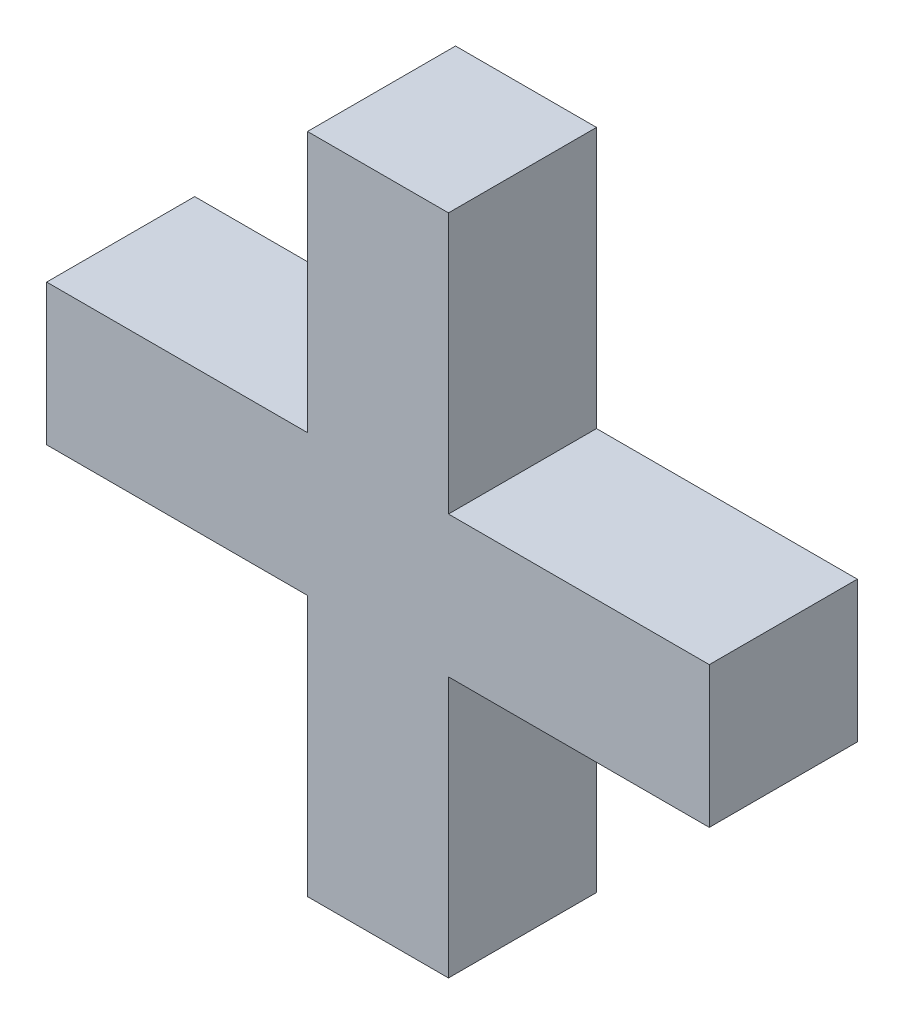
ISO-10303-21;
HEADER;
FILE_DESCRIPTION(('STEP AP214'),'2;1');
FILE_NAME('part.step','',(''),(''),'','','');
FILE_SCHEMA(('AUTOMOTIVE_DESIGN { 1 0 10303 214 1 1 1 1 }'));
ENDSEC;
DATA;
#1=APPLICATION_CONTEXT('core data for automotive mechanical design processes');
#2=APPLICATION_PROTOCOL_DEFINITION('international standard','automotive_design',2000,#1);
#3=PRODUCT_CONTEXT('',#1,'mechanical');
#4=PRODUCT('Part','Part','',(#3));
#5=PRODUCT_RELATED_PRODUCT_CATEGORY('part','',(#4));
#6=PRODUCT_DEFINITION_FORMATION('','',#4);
#7=PRODUCT_DEFINITION_CONTEXT('part definition',#1,'design');
#8=PRODUCT_DEFINITION('design','',#6,#7);
#9=PRODUCT_DEFINITION_SHAPE('','',#8);
#10=(LENGTH_UNIT() NAMED_UNIT(*) SI_UNIT(.MILLI.,.METRE.));
#11=(NAMED_UNIT(*) PLANE_ANGLE_UNIT() SI_UNIT($,.RADIAN.));
#12=(NAMED_UNIT(*) SI_UNIT($,.STERADIAN.) SOLID_ANGLE_UNIT());
#13=UNCERTAINTY_MEASURE_WITH_UNIT(LENGTH_MEASURE(1.E-05),#10,'distance_accuracy_value','');
#14=(GEOMETRIC_REPRESENTATION_CONTEXT(3) GLOBAL_UNCERTAINTY_ASSIGNED_CONTEXT((#13)) GLOBAL_UNIT_ASSIGNED_CONTEXT((#10,
#11,#12)) REPRESENTATION_CONTEXT('',''));
#15=CARTESIAN_POINT('',(0.,0.,0.));
#16=DIRECTION('',(0.,0.,1.));
#17=DIRECTION('',(1.,0.,0.));
#18=AXIS2_PLACEMENT_3D('',#15,#16,#17);
#19=CARTESIAN_POINT('',(0.,0.,10.5));
#20=DIRECTION('',(1.,0.,0.));
#21=DIRECTION('',(0.,0.,-1.));
#22=AXIS2_PLACEMENT_3D('',#19,#20,#21);
#23=PLANE('',#22);
#24=DIRECTION('',(0.,-1.,0.));
#25=VECTOR('',#24,1.);
#26=CARTESIAN_POINT('',(0.,0.,0.));
#27=LINE('',#26,#25);
#28=CARTESIAN_POINT('',(0.,18.5,0.));
#29=VERTEX_POINT('',#28);
#30=CARTESIAN_POINT('',(0.,0.,0.));
#31=VERTEX_POINT('',#30);
#32=EDGE_CURVE('E153',#29,#31,#27,.T.);
#33=ORIENTED_EDGE('',*,*,#32,.T.);
#34=DIRECTION('',(0.,0.,-1.));
#35=VECTOR('',#34,1.);
#36=CARTESIAN_POINT('',(0.,0.,10.5));
#37=LINE('',#36,#35);
#38=CARTESIAN_POINT('',(0.,0.,10.5));
#39=VERTEX_POINT('',#38);
#40=EDGE_CURVE('E11',#39,#31,#37,.T.);
#41=ORIENTED_EDGE('',*,*,#40,.F.);
#42=DIRECTION('',(0.,-1.,0.));
#43=VECTOR('',#42,1.);
#44=CARTESIAN_POINT('',(0.,0.,10.5));
#45=LINE('',#44,#43);
#46=CARTESIAN_POINT('',(0.,18.5,10.5));
#47=VERTEX_POINT('',#46);
#48=EDGE_CURVE('E175',#47,#39,#45,.T.);
#49=ORIENTED_EDGE('',*,*,#48,.F.);
#50=DIRECTION('',(0.,0.,-1.));
#51=VECTOR('',#50,1.);
#52=CARTESIAN_POINT('',(0.,18.5,10.5));
#53=LINE('',#52,#51);
#54=EDGE_CURVE('E149',#47,#29,#53,.T.);
#55=ORIENTED_EDGE('',*,*,#54,.T.);
#56=EDGE_LOOP('',(#33,#41,#49,#55));
#57=FACE_BOUND('',#56,.T.);
#58=ADVANCED_FACE('F33',(#57),#23,.F.);
#59=CARTESIAN_POINT('',(0.,0.,10.5));
#60=DIRECTION('',(0.,1.,0.));
#61=DIRECTION('',(0.,0.,1.));
#62=AXIS2_PLACEMENT_3D('',#59,#60,#61);
#63=PLANE('',#62);
#64=DIRECTION('',(1.,0.,0.));
#65=VECTOR('',#64,1.);
#66=CARTESIAN_POINT('',(0.,0.,0.));
#67=LINE('',#66,#65);
#68=CARTESIAN_POINT('',(10.,0.,0.));
#69=VERTEX_POINT('',#68);
#70=EDGE_CURVE('E156',#31,#69,#67,.T.);
#71=ORIENTED_EDGE('',*,*,#70,.T.);
#72=DIRECTION('',(0.,0.,-1.));
#73=VECTOR('',#72,1.);
#74=CARTESIAN_POINT('',(10.,0.,10.5));
#75=LINE('',#74,#73);
#76=CARTESIAN_POINT('',(10.,0.,10.5));
#77=VERTEX_POINT('',#76);
#78=EDGE_CURVE('E41',#77,#69,#75,.T.);
#79=ORIENTED_EDGE('',*,*,#78,.F.);
#80=DIRECTION('',(1.,0.,0.));
#81=VECTOR('',#80,1.);
#82=CARTESIAN_POINT('',(0.,0.,10.5));
#83=LINE('',#82,#81);
#84=EDGE_CURVE('E104',#39,#77,#83,.T.);
#85=ORIENTED_EDGE('',*,*,#84,.F.);
#86=ORIENTED_EDGE('',*,*,#40,.T.);
#87=EDGE_LOOP('',(#71,#79,#85,#86));
#88=FACE_BOUND('',#87,.T.);
#89=ADVANCED_FACE('F253',(#88),#63,.F.);
#90=CARTESIAN_POINT('',(10.,0.,10.5));
#91=DIRECTION('',(-1.,0.,0.));
#92=DIRECTION('',(0.,0.,1.));
#93=AXIS2_PLACEMENT_3D('',#90,#91,#92);
#94=PLANE('',#93);
#95=DIRECTION('',(0.,1.,0.));
#96=VECTOR('',#95,1.);
#97=CARTESIAN_POINT('',(10.,0.,0.));
#98=LINE('',#97,#96);
#99=CARTESIAN_POINT('',(10.,18.5,0.));
#100=VERTEX_POINT('',#99);
#101=EDGE_CURVE('E158',#69,#100,#98,.T.);
#102=ORIENTED_EDGE('',*,*,#101,.T.);
#103=DIRECTION('',(0.,0.,-1.));
#104=VECTOR('',#103,1.);
#105=CARTESIAN_POINT('',(10.,18.5,10.5));
#106=LINE('',#105,#104);
#107=CARTESIAN_POINT('',(10.,18.5,10.5));
#108=VERTEX_POINT('',#107);
#109=EDGE_CURVE('E194',#108,#100,#106,.T.);
#110=ORIENTED_EDGE('',*,*,#109,.F.);
#111=DIRECTION('',(0.,1.,0.));
#112=VECTOR('',#111,1.);
#113=CARTESIAN_POINT('',(10.,0.,10.5));
#114=LINE('',#113,#112);
#115=EDGE_CURVE('E202',#77,#108,#114,.T.);
#116=ORIENTED_EDGE('',*,*,#115,.F.);
#117=ORIENTED_EDGE('',*,*,#78,.T.);
#118=EDGE_LOOP('',(#102,#110,#116,#117));
#119=FACE_BOUND('',#118,.T.);
#120=ADVANCED_FACE('F200',(#119),#94,.F.);
#121=CARTESIAN_POINT('',(10.,18.5,10.5));
#122=DIRECTION('',(0.,1.,0.));
#123=DIRECTION('',(0.,0.,1.));
#124=AXIS2_PLACEMENT_3D('',#121,#122,#123);
#125=PLANE('',#124);
#126=DIRECTION('',(1.,0.,0.));
#127=VECTOR('',#126,1.);
#128=CARTESIAN_POINT('',(10.,18.5,0.));
#129=LINE('',#128,#127);
#130=CARTESIAN_POINT('',(28.5,18.5,0.));
#131=VERTEX_POINT('',#130);
#132=EDGE_CURVE('E160',#100,#131,#129,.T.);
#133=ORIENTED_EDGE('',*,*,#132,.T.);
#134=DIRECTION('',(0.,0.,-1.));
#135=VECTOR('',#134,1.);
#136=CARTESIAN_POINT('',(28.5,18.5,10.5));
#137=LINE('',#136,#135);
#138=CARTESIAN_POINT('',(28.5,18.5,10.5));
#139=VERTEX_POINT('',#138);
#140=EDGE_CURVE('E191',#139,#131,#137,.T.);
#141=ORIENTED_EDGE('',*,*,#140,.F.);
#142=DIRECTION('',(1.,0.,0.));
#143=VECTOR('',#142,1.);
#144=CARTESIAN_POINT('',(10.,18.5,10.5));
#145=LINE('',#144,#143);
#146=EDGE_CURVE('E220',#108,#139,#145,.T.);
#147=ORIENTED_EDGE('',*,*,#146,.F.);
#148=ORIENTED_EDGE('',*,*,#109,.T.);
#149=EDGE_LOOP('',(#133,#141,#147,#148));
#150=FACE_BOUND('',#149,.T.);
#151=ADVANCED_FACE('F211',(#150),#125,.F.);
#152=CARTESIAN_POINT('',(28.5,28.5,10.5));
#153=DIRECTION('',(-1.,0.,0.));
#154=DIRECTION('',(0.,0.,1.));
#155=AXIS2_PLACEMENT_3D('',#152,#153,#154);
#156=PLANE('',#155);
#157=DIRECTION('',(0.,1.,0.));
#158=VECTOR('',#157,1.);
#159=CARTESIAN_POINT('',(28.5,28.5,0.));
#160=LINE('',#159,#158);
#161=CARTESIAN_POINT('',(28.5,28.5,0.));
#162=VERTEX_POINT('',#161);
#163=EDGE_CURVE('E162',#131,#162,#160,.T.);
#164=ORIENTED_EDGE('',*,*,#163,.T.);
#165=DIRECTION('',(0.,0.,-1.));
#166=VECTOR('',#165,1.);
#167=CARTESIAN_POINT('',(28.5,28.5,10.5));
#168=LINE('',#167,#166);
#169=CARTESIAN_POINT('',(28.5,28.5,10.5));
#170=VERTEX_POINT('',#169);
#171=EDGE_CURVE('E188',#170,#162,#168,.T.);
#172=ORIENTED_EDGE('',*,*,#171,.F.);
#173=DIRECTION('',(0.,1.,0.));
#174=VECTOR('',#173,1.);
#175=CARTESIAN_POINT('',(28.5,28.5,10.5));
#176=LINE('',#175,#174);
#177=EDGE_CURVE('E217',#139,#170,#176,.T.);
#178=ORIENTED_EDGE('',*,*,#177,.F.);
#179=ORIENTED_EDGE('',*,*,#140,.T.);
#180=EDGE_LOOP('',(#164,#172,#178,#179));
#181=FACE_BOUND('',#180,.T.);
#182=ADVANCED_FACE('F215',(#181),#156,.F.);
#183=CARTESIAN_POINT('',(10.,28.5,10.5));
#184=DIRECTION('',(0.,-1.,0.));
#185=DIRECTION('',(0.,0.,-1.));
#186=AXIS2_PLACEMENT_3D('',#183,#184,#185);
#187=PLANE('',#186);
#188=DIRECTION('',(-1.,0.,0.));
#189=VECTOR('',#188,1.);
#190=CARTESIAN_POINT('',(10.,28.5,0.));
#191=LINE('',#190,#189);
#192=CARTESIAN_POINT('',(10.,28.5,0.));
#193=VERTEX_POINT('',#192);
#194=EDGE_CURVE('E164',#162,#193,#191,.T.);
#195=ORIENTED_EDGE('',*,*,#194,.T.);
#196=DIRECTION('',(0.,0.,-1.));
#197=VECTOR('',#196,1.);
#198=CARTESIAN_POINT('',(10.,28.5,10.5));
#199=LINE('',#198,#197);
#200=CARTESIAN_POINT('',(10.,28.5,10.5));
#201=VERTEX_POINT('',#200);
#202=EDGE_CURVE('E185',#201,#193,#199,.T.);
#203=ORIENTED_EDGE('',*,*,#202,.F.);
#204=DIRECTION('',(-1.,0.,0.));
#205=VECTOR('',#204,1.);
#206=CARTESIAN_POINT('',(10.,28.5,10.5));
#207=LINE('',#206,#205);
#208=EDGE_CURVE('E219',#170,#201,#207,.T.);
#209=ORIENTED_EDGE('',*,*,#208,.F.);
#210=ORIENTED_EDGE('',*,*,#171,.T.);
#211=EDGE_LOOP('',(#195,#203,#209,#210));
#212=FACE_BOUND('',#211,.T.);
#213=ADVANCED_FACE('F266',(#212),#187,.F.);
#214=CARTESIAN_POINT('',(10.,28.5,10.5));
#215=DIRECTION('',(-1.,0.,0.));
#216=DIRECTION('',(0.,-1.,0.));
#217=AXIS2_PLACEMENT_3D('',#214,#215,#216);
#218=PLANE('',#217);
#219=DIRECTION('',(0.,1.,0.));
#220=VECTOR('',#219,1.);
#221=CARTESIAN_POINT('',(10.,28.5,0.));
#222=LINE('',#221,#220);
#223=CARTESIAN_POINT('',(10.,47.,0.));
#224=VERTEX_POINT('',#223);
#225=EDGE_CURVE('E166',#193,#224,#222,.T.);
#226=ORIENTED_EDGE('',*,*,#225,.T.);
#227=DIRECTION('',(0.,0.,-1.));
#228=VECTOR('',#227,1.);
#229=CARTESIAN_POINT('',(10.,47.,10.5));
#230=LINE('',#229,#228);
#231=CARTESIAN_POINT('',(10.,47.,10.5));
#232=VERTEX_POINT('',#231);
#233=EDGE_CURVE('E182',#232,#224,#230,.T.);
#234=ORIENTED_EDGE('',*,*,#233,.F.);
#235=DIRECTION('',(0.,1.,0.));
#236=VECTOR('',#235,1.);
#237=CARTESIAN_POINT('',(10.,28.5,10.5));
#238=LINE('',#237,#236);
#239=EDGE_CURVE('E222',#201,#232,#238,.T.);
#240=ORIENTED_EDGE('',*,*,#239,.F.);
#241=ORIENTED_EDGE('',*,*,#202,.T.);
#242=EDGE_LOOP('',(#226,#234,#240,#241));
#243=FACE_BOUND('',#242,.T.);
#244=ADVANCED_FACE('F269',(#243),#218,.F.);
#245=CARTESIAN_POINT('',(0.,47.,10.5));
#246=DIRECTION('',(0.,-1.,0.));
#247=DIRECTION('',(0.,0.,-1.));
#248=AXIS2_PLACEMENT_3D('',#245,#246,#247);
#249=PLANE('',#248);
#250=DIRECTION('',(-1.,0.,0.));
#251=VECTOR('',#250,1.);
#252=CARTESIAN_POINT('',(0.,47.,0.));
#253=LINE('',#252,#251);
#254=CARTESIAN_POINT('',(0.,47.,0.));
#255=VERTEX_POINT('',#254);
#256=EDGE_CURVE('E168',#224,#255,#253,.T.);
#257=ORIENTED_EDGE('',*,*,#256,.T.);
#258=DIRECTION('',(0.,0.,-1.));
#259=VECTOR('',#258,1.);
#260=CARTESIAN_POINT('',(0.,47.,10.5));
#261=LINE('',#260,#259);
#262=CARTESIAN_POINT('',(0.,47.,10.5));
#263=VERTEX_POINT('',#262);
#264=EDGE_CURVE('E179',#263,#255,#261,.T.);
#265=ORIENTED_EDGE('',*,*,#264,.F.);
#266=DIRECTION('',(-1.,0.,0.));
#267=VECTOR('',#266,1.);
#268=CARTESIAN_POINT('',(0.,47.,10.5));
#269=LINE('',#268,#267);
#270=EDGE_CURVE('E228',#232,#263,#269,.T.);
#271=ORIENTED_EDGE('',*,*,#270,.F.);
#272=ORIENTED_EDGE('',*,*,#233,.T.);
#273=EDGE_LOOP('',(#257,#265,#271,#272));
#274=FACE_BOUND('',#273,.T.);
#275=ADVANCED_FACE('F234',(#274),#249,.F.);
#276=CARTESIAN_POINT('',(0.,28.5,10.5));
#277=DIRECTION('',(1.,0.,0.));
#278=DIRECTION('',(0.,1.,0.));
#279=AXIS2_PLACEMENT_3D('',#276,#277,#278);
#280=PLANE('',#279);
#281=DIRECTION('',(0.,-1.,0.));
#282=VECTOR('',#281,1.);
#283=CARTESIAN_POINT('',(0.,28.5,0.));
#284=LINE('',#283,#282);
#285=CARTESIAN_POINT('',(0.,28.5,0.));
#286=VERTEX_POINT('',#285);
#287=EDGE_CURVE('E170',#255,#286,#284,.T.);
#288=ORIENTED_EDGE('',*,*,#287,.T.);
#289=DIRECTION('',(0.,0.,-1.));
#290=VECTOR('',#289,1.);
#291=CARTESIAN_POINT('',(0.,28.5,10.5));
#292=LINE('',#291,#290);
#293=CARTESIAN_POINT('',(0.,28.5,10.5));
#294=VERTEX_POINT('',#293);
#295=EDGE_CURVE('E144',#294,#286,#292,.T.);
#296=ORIENTED_EDGE('',*,*,#295,.F.);
#297=DIRECTION('',(0.,-1.,0.));
#298=VECTOR('',#297,1.);
#299=CARTESIAN_POINT('',(0.,28.5,10.5));
#300=LINE('',#299,#298);
#301=EDGE_CURVE('E135',#263,#294,#300,.T.);
#302=ORIENTED_EDGE('',*,*,#301,.F.);
#303=ORIENTED_EDGE('',*,*,#264,.T.);
#304=EDGE_LOOP('',(#288,#296,#302,#303));
#305=FACE_BOUND('',#304,.T.);
#306=ADVANCED_FACE('F238',(#305),#280,.F.);
#307=CARTESIAN_POINT('',(-18.5,28.5,10.5));
#308=DIRECTION('',(0.,-1.,0.));
#309=DIRECTION('',(0.,0.,-1.));
#310=AXIS2_PLACEMENT_3D('',#307,#308,#309);
#311=PLANE('',#310);
#312=DIRECTION('',(-1.,0.,0.));
#313=VECTOR('',#312,1.);
#314=CARTESIAN_POINT('',(-18.5,28.5,0.));
#315=LINE('',#314,#313);
#316=CARTESIAN_POINT('',(-18.5,28.5,0.));
#317=VERTEX_POINT('',#316);
#318=EDGE_CURVE('E143',#286,#317,#315,.T.);
#319=ORIENTED_EDGE('',*,*,#318,.T.);
#320=DIRECTION('',(0.,0.,-1.));
#321=VECTOR('',#320,1.);
#322=CARTESIAN_POINT('',(-18.5,28.5,10.5));
#323=LINE('',#322,#321);
#324=CARTESIAN_POINT('',(-18.5,28.5,10.5));
#325=VERTEX_POINT('',#324);
#326=EDGE_CURVE('E140',#325,#317,#323,.T.);
#327=ORIENTED_EDGE('',*,*,#326,.F.);
#328=DIRECTION('',(-1.,0.,0.));
#329=VECTOR('',#328,1.);
#330=CARTESIAN_POINT('',(-18.5,28.5,10.5));
#331=LINE('',#330,#329);
#332=EDGE_CURVE('E129',#294,#325,#331,.T.);
#333=ORIENTED_EDGE('',*,*,#332,.F.);
#334=ORIENTED_EDGE('',*,*,#295,.T.);
#335=EDGE_LOOP('',(#319,#327,#333,#334));
#336=FACE_BOUND('',#335,.T.);
#337=ADVANCED_FACE('F141',(#336),#311,.F.);
#338=CARTESIAN_POINT('',(-18.5,28.5,10.5));
#339=DIRECTION('',(1.,0.,0.));
#340=DIRECTION('',(0.,0.,-1.));
#341=AXIS2_PLACEMENT_3D('',#338,#339,#340);
#342=PLANE('',#341);
#343=DIRECTION('',(0.,-1.,0.));
#344=VECTOR('',#343,1.);
#345=CARTESIAN_POINT('',(-18.5,28.5,0.));
#346=LINE('',#345,#344);
#347=CARTESIAN_POINT('',(-18.5,18.5,0.));
#348=VERTEX_POINT('',#347);
#349=EDGE_CURVE('E90',#317,#348,#346,.T.);
#350=ORIENTED_EDGE('',*,*,#349,.T.);
#351=DIRECTION('',(0.,0.,-1.));
#352=VECTOR('',#351,1.);
#353=CARTESIAN_POINT('',(-18.5,18.5,10.5));
#354=LINE('',#353,#352);
#355=CARTESIAN_POINT('',(-18.5,18.5,10.5));
#356=VERTEX_POINT('',#355);
#357=EDGE_CURVE('E145',#356,#348,#354,.T.);
#358=ORIENTED_EDGE('',*,*,#357,.F.);
#359=DIRECTION('',(0.,-1.,0.));
#360=VECTOR('',#359,1.);
#361=CARTESIAN_POINT('',(-18.5,28.5,10.5));
#362=LINE('',#361,#360);
#363=EDGE_CURVE('E133',#325,#356,#362,.T.);
#364=ORIENTED_EDGE('',*,*,#363,.F.);
#365=ORIENTED_EDGE('',*,*,#326,.T.);
#366=EDGE_LOOP('',(#350,#358,#364,#365));
#367=FACE_BOUND('',#366,.T.);
#368=ADVANCED_FACE('F147',(#367),#342,.F.);
#369=CARTESIAN_POINT('',(-18.5,18.5,10.5));
#370=DIRECTION('',(0.,1.,0.));
#371=DIRECTION('',(0.,0.,1.));
#372=AXIS2_PLACEMENT_3D('',#369,#370,#371);
#373=PLANE('',#372);
#374=DIRECTION('',(1.,0.,0.));
#375=VECTOR('',#374,1.);
#376=CARTESIAN_POINT('',(-18.5,18.5,0.));
#377=LINE('',#376,#375);
#378=EDGE_CURVE('E96',#348,#29,#377,.T.);
#379=ORIENTED_EDGE('',*,*,#378,.T.);
#380=ORIENTED_EDGE('',*,*,#54,.F.);
#381=DIRECTION('',(1.,0.,0.));
#382=VECTOR('',#381,1.);
#383=CARTESIAN_POINT('',(-18.5,18.5,10.5));
#384=LINE('',#383,#382);
#385=EDGE_CURVE('E49',#356,#47,#384,.T.);
#386=ORIENTED_EDGE('',*,*,#385,.F.);
#387=ORIENTED_EDGE('',*,*,#357,.T.);
#388=EDGE_LOOP('',(#379,#380,#386,#387));
#389=FACE_BOUND('',#388,.T.);
#390=ADVANCED_FACE('F242',(#389),#373,.F.);
#391=CARTESIAN_POINT('',(0.,0.,10.5));
#392=DIRECTION('',(0.,0.,-1.));
#393=DIRECTION('',(-1.,0.,0.));
#394=AXIS2_PLACEMENT_3D('',#391,#392,#393);
#395=PLANE('',#394);
#396=ORIENTED_EDGE('',*,*,#48,.T.);
#397=ORIENTED_EDGE('',*,*,#84,.T.);
#398=ORIENTED_EDGE('',*,*,#115,.T.);
#399=ORIENTED_EDGE('',*,*,#146,.T.);
#400=ORIENTED_EDGE('',*,*,#177,.T.);
#401=ORIENTED_EDGE('',*,*,#208,.T.);
#402=ORIENTED_EDGE('',*,*,#239,.T.);
#403=ORIENTED_EDGE('',*,*,#270,.T.);
#404=ORIENTED_EDGE('',*,*,#301,.T.);
#405=ORIENTED_EDGE('',*,*,#332,.T.);
#406=ORIENTED_EDGE('',*,*,#363,.T.);
#407=ORIENTED_EDGE('',*,*,#385,.T.);
#408=EDGE_LOOP('',(#396,#397,#398,#399,#400,#401,#402,#403,#404,#405,#406,#407));
#409=FACE_BOUND('',#408,.T.);
#410=ADVANCED_FACE('F131',(#409),#395,.F.);
#411=CARTESIAN_POINT('',(0.,0.,0.));
#412=DIRECTION('',(0.,0.,-1.));
#413=DIRECTION('',(-1.,0.,0.));
#414=AXIS2_PLACEMENT_3D('',#411,#412,#413);
#415=PLANE('',#414);
#416=ORIENTED_EDGE('',*,*,#32,.F.);
#417=ORIENTED_EDGE('',*,*,#378,.F.);
#418=ORIENTED_EDGE('',*,*,#349,.F.);
#419=ORIENTED_EDGE('',*,*,#318,.F.);
#420=ORIENTED_EDGE('',*,*,#287,.F.);
#421=ORIENTED_EDGE('',*,*,#256,.F.);
#422=ORIENTED_EDGE('',*,*,#225,.F.);
#423=ORIENTED_EDGE('',*,*,#194,.F.);
#424=ORIENTED_EDGE('',*,*,#163,.F.);
#425=ORIENTED_EDGE('',*,*,#132,.F.);
#426=ORIENTED_EDGE('',*,*,#101,.F.);
#427=ORIENTED_EDGE('',*,*,#70,.F.);
#428=EDGE_LOOP('',(#416,#417,#418,#419,#420,#421,#422,#423,#424,#425,#426,#427));
#429=FACE_BOUND('',#428,.T.);
#430=ADVANCED_FACE('F206',(#429),#415,.T.);
#431=CLOSED_SHELL('',(#58,#89,#120,#151,#182,#213,#244,#275,#306,#337,#368,#390,#410,#430));
#432=MANIFOLD_SOLID_BREP('B2',#431);
#433=ADVANCED_BREP_SHAPE_REPRESENTATION('',(#18,#432),#14);
#434=SHAPE_DEFINITION_REPRESENTATION(#9,#433);
ENDSEC;
END-ISO-10303-21;
